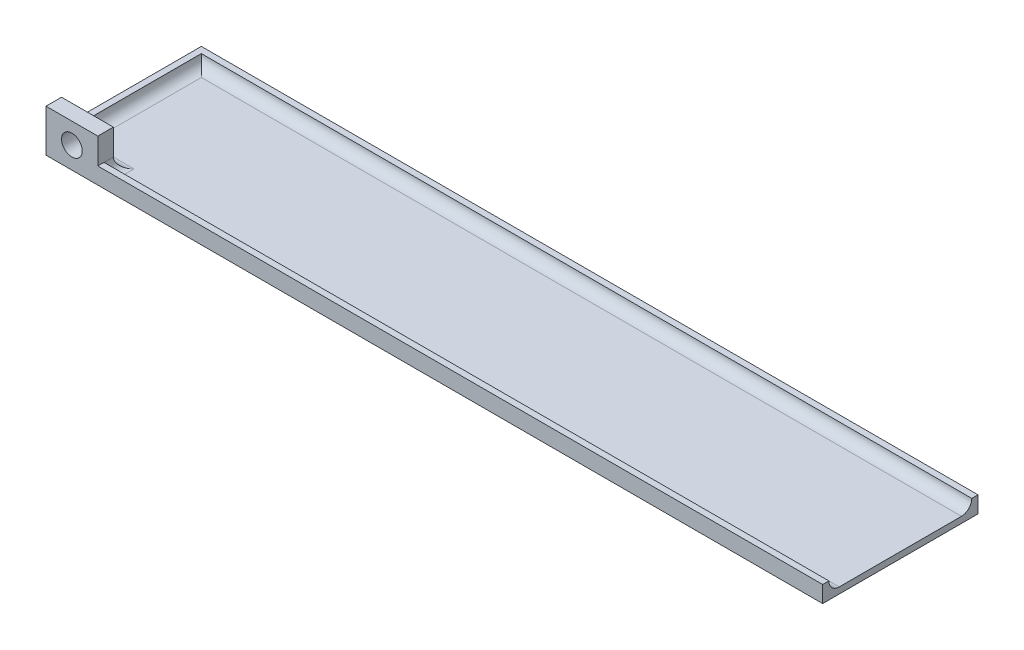
ISO-10303-21;
HEADER;
FILE_DESCRIPTION(('STEP AP214'),'2;1');
FILE_NAME('part.step','',(''),(''),'','','');
FILE_SCHEMA(('AUTOMOTIVE_DESIGN { 1 0 10303 214 1 1 1 1 }'));
ENDSEC;
DATA;
#1=APPLICATION_CONTEXT('core data for automotive mechanical design processes');
#2=APPLICATION_PROTOCOL_DEFINITION('international standard','automotive_design',2000,#1);
#3=PRODUCT_CONTEXT('',#1,'mechanical');
#4=PRODUCT('Part','Part','',(#3));
#5=PRODUCT_RELATED_PRODUCT_CATEGORY('part','',(#4));
#6=PRODUCT_DEFINITION_FORMATION('','',#4);
#7=PRODUCT_DEFINITION_CONTEXT('part definition',#1,'design');
#8=PRODUCT_DEFINITION('design','',#6,#7);
#9=PRODUCT_DEFINITION_SHAPE('','',#8);
#10=(LENGTH_UNIT() NAMED_UNIT(*) SI_UNIT(.MILLI.,.METRE.));
#11=(NAMED_UNIT(*) PLANE_ANGLE_UNIT() SI_UNIT($,.RADIAN.));
#12=(NAMED_UNIT(*) SI_UNIT($,.STERADIAN.) SOLID_ANGLE_UNIT());
#13=UNCERTAINTY_MEASURE_WITH_UNIT(LENGTH_MEASURE(1.E-05),#10,'distance_accuracy_value','');
#14=(GEOMETRIC_REPRESENTATION_CONTEXT(3) GLOBAL_UNCERTAINTY_ASSIGNED_CONTEXT((#13)) GLOBAL_UNIT_ASSIGNED_CONTEXT((#10,
#11,#12)) REPRESENTATION_CONTEXT('',''));
#15=CARTESIAN_POINT('',(0.,0.,0.));
#16=DIRECTION('',(0.,0.,1.));
#17=DIRECTION('',(1.,0.,0.));
#18=AXIS2_PLACEMENT_3D('',#15,#16,#17);
#19=CARTESIAN_POINT('',(0.,1.2,0.));
#20=DIRECTION('',(0.,1.,0.));
#21=DIRECTION('',(0.,0.,1.));
#22=AXIS2_PLACEMENT_3D('',#19,#20,#21);
#23=PLANE('',#22);
#24=DIRECTION('',(0.,0.,-1.));
#25=VECTOR('',#24,1.);
#26=CARTESIAN_POINT('',(74.9999999999999,1.2,-15.));
#27=LINE('',#26,#25);
#28=CARTESIAN_POINT('',(74.9999999999999,1.2,11.8));
#29=VERTEX_POINT('',#28);
#30=CARTESIAN_POINT('',(74.9999999999999,1.2,-11.8));
#31=VERTEX_POINT('',#30);
#32=EDGE_CURVE('E297',#29,#31,#27,.T.);
#33=ORIENTED_EDGE('',*,*,#32,.T.);
#34=DIRECTION('',(1.,0.,0.));
#35=VECTOR('',#34,1.);
#36=CARTESIAN_POINT('',(0.,1.2,-11.8));
#37=LINE('',#36,#35);
#38=CARTESIAN_POINT('',(-71.8000000000001,1.2,-11.8));
#39=VERTEX_POINT('',#38);
#40=EDGE_CURVE('E60',#31,#39,#37,.F.);
#41=ORIENTED_EDGE('',*,*,#40,.T.);
#42=DIRECTION('',(0.,0.,-1.));
#43=VECTOR('',#42,1.);
#44=CARTESIAN_POINT('',(-71.8000000000001,1.2,0.));
#45=LINE('',#44,#43);
#46=CARTESIAN_POINT('',(-71.8000000000001,1.2,9.99999999999998));
#47=VERTEX_POINT('',#46);
#48=EDGE_CURVE('E65',#39,#47,#45,.F.);
#49=ORIENTED_EDGE('',*,*,#48,.T.);
#50=DIRECTION('',(-1.,0.,0.));
#51=VECTOR('',#50,1.);
#52=CARTESIAN_POINT('',(0.,1.2,9.99999999999999));
#53=LINE('',#52,#51);
#54=CARTESIAN_POINT('',(-71.7320508075689,1.2,9.99999999999998));
#55=VERTEX_POINT('',#54);
#56=EDGE_CURVE('E182',#47,#55,#53,.F.);
#57=ORIENTED_EDGE('',*,*,#56,.T.);
#58=CARTESIAN_POINT('',(-72.3361605436258,1.2,10.074613416251));
#59=CARTESIAN_POINT('',(-71.7793432797953,1.2,12.2294552747499));
#60=CARTESIAN_POINT('',(-71.8386351752789,3.41296715937179,12.));
#61=CARTESIAN_POINT('',(-72.2780480130461,1.2,10.0595857814593));
#62=CARTESIAN_POINT('',(-71.7834580219336,1.2,12.2113937022727));
#63=CARTESIAN_POINT('',(-71.8315296040001,3.39641677519278,12.));
#64=CARTESIAN_POINT('',(-72.2193466671237,1.2,10.0469134668366));
#65=CARTESIAN_POINT('',(-71.78550810038,1.2,12.1917046451878));
#66=CARTESIAN_POINT('',(-71.8237265095642,3.37875992428455,12.));
#67=CARTESIAN_POINT('',(-72.1008864416683,1.2,10.0260887534728));
#68=CARTESIAN_POINT('',(-71.7844563230043,1.2,12.14950428987));
#69=CARTESIAN_POINT('',(-71.8061757181743,3.34082048307898,12.));
#70=CARTESIAN_POINT('',(-72.0411241173482,1.2,10.017955880954));
#71=CARTESIAN_POINT('',(-71.7813860427762,1.2,12.1270342497116));
#72=CARTESIAN_POINT('',(-71.7964198620172,3.32052700541513,12.));
#73=CARTESIAN_POINT('',(-71.9216495936106,1.2,10.0061929621261));
#74=CARTESIAN_POINT('',(-71.7692815314671,1.2,12.0800013050037));
#75=CARTESIAN_POINT('',(-71.7745546166674,3.27721292130921,12.));
#76=CARTESIAN_POINT('',(-71.861940896979,1.2,10.0025270347042));
#77=CARTESIAN_POINT('',(-71.760370721576,1.2,12.055514701291));
#78=CARTESIAN_POINT('',(-71.7624648977458,3.25421569539413,12.));
#79=CARTESIAN_POINT('',(-71.772400913129,1.2,10.0001363519426));
#80=CARTESIAN_POINT('',(-71.7419098579096,1.2,12.0174692649333));
#81=CARTESIAN_POINT('',(-71.7420105769733,3.21735238064977,12.));
#82=CARTESIAN_POINT('',(-71.742602447226,1.2,9.999855610103));
#83=CARTESIAN_POINT('',(-71.7349686393547,1.2,12.0046580087224));
#84=CARTESIAN_POINT('',(-71.7348182722216,3.20469063480429,12.));
#85=CARTESIAN_POINT('',(-71.6830109305521,1.2,10.0002828795743));
#86=CARTESIAN_POINT('',(-71.7193202778669,1.2,11.9787149718989));
#87=CARTESIAN_POINT('',(-71.7195397778625,3.1785271605937,12.));
#88=CARTESIAN_POINT('',(-71.6532178805064,1.2,10.0009909795572));
#89=CARTESIAN_POINT('',(-71.7106271482965,1.2,11.965589784079));
#90=CARTESIAN_POINT('',(-71.711453508151,3.16502535700224,12.));
#91=CARTESIAN_POINT('',(-71.5198567668734,1.2,10.0063015516842));
#92=CARTESIAN_POINT('',(-71.6678853766301,1.2,11.906746009344));
#93=CARTESIAN_POINT('',(-71.6729986446206,3.10254768616981,12.));
#94=CARTESIAN_POINT('',(-71.416459257844,1.2,10.0162064163513));
#95=CARTESIAN_POINT('',(-71.623581120779,1.2,11.8593220504645));
#96=CARTESIAN_POINT('',(-71.6370780063262,3.04859227062018,12.));
#97=CARTESIAN_POINT('',(-71.2624012086411,1.2,10.0379133282181));
#98=CARTESIAN_POINT('',(-71.5361260303841,1.2,11.7884868200293));
#99=CARTESIAN_POINT('',(-71.5685927096965,2.9586727383819,12.));
#100=CARTESIAN_POINT('',(-71.2111941831751,1.2,10.0462969502341));
#101=CARTESIAN_POINT('',(-71.5039275746085,1.2,11.7651847206798));
#102=CARTESIAN_POINT('',(-71.5433126133241,2.92718238462153,12.));
#103=CARTESIAN_POINT('',(-71.1091176563972,1.2,10.0649236287315));
#104=CARTESIAN_POINT('',(-71.4323079066144,1.2,11.7194356133435));
#105=CARTESIAN_POINT('',(-71.48650082509,2.86126050765092,12.));
#106=CARTESIAN_POINT('',(-71.0582481383648,1.2,10.075166592375));
#107=CARTESIAN_POINT('',(-71.3930230577661,1.2,11.6969983897116));
#108=CARTESIAN_POINT('',(-71.4549694453513,2.8268291313331,12.));
#109=CARTESIAN_POINT('',(-70.9568966571514,1.2,10.0969825843311));
#110=CARTESIAN_POINT('',(-71.3068412249275,1.2,11.6536031765381));
#111=CARTESIAN_POINT('',(-71.3841060809588,2.75543238469486,12.));
#112=CARTESIAN_POINT('',(-70.9064141698811,1.2,10.1085532428426));
#113=CARTESIAN_POINT('',(-71.2601022670233,1.2,11.6326381424602));
#114=CARTESIAN_POINT('',(-71.3447879065872,2.71847157533647,12.));
#115=CARTESIAN_POINT('',(-70.8056171026324,1.2,10.1323962816697));
#116=CARTESIAN_POINT('',(-71.1585527503052,1.2,11.5927432010098));
#117=CARTESIAN_POINT('',(-71.2564024483976,2.64281015255396,12.));
#118=CARTESIAN_POINT('',(-70.7553025258216,1.2,10.1446686751453));
#119=CARTESIAN_POINT('',(-71.103878840332,1.2,11.5737900609705));
#120=CARTESIAN_POINT('',(-71.2073349817048,2.60410950650493,12.));
#121=CARTESIAN_POINT('',(-70.654642318298,1.2,10.1691033108521));
#122=CARTESIAN_POINT('',(-70.9861917652828,1.2,11.5385236212672));
#123=CARTESIAN_POINT('',(-71.0974118846476,2.52661811547286,12.));
#124=CARTESIAN_POINT('',(-70.6042966856264,1.2,10.1812655451651));
#125=CARTESIAN_POINT('',(-70.9232815336361,1.2,11.5221670410715));
#126=CARTESIAN_POINT('',(-71.0365554138279,2.48782736426101,12.));
#127=CARTESIAN_POINT('',(-70.5033257844245,1.2,10.2044603453027));
#128=CARTESIAN_POINT('',(-70.7891821908066,1.2,11.4926966209242));
#129=CARTESIAN_POINT('',(-70.9013503902115,2.41295542475095,12.));
#130=CARTESIAN_POINT('',(-70.452700456864,1.2,10.2154926622448));
#131=CARTESIAN_POINT('',(-70.7180178214445,1.2,11.4795212852324));
#132=CARTESIAN_POINT('',(-70.8269988748707,2.37687483387351,12.));
#133=CARTESIAN_POINT('',(-70.3492931979017,1.2,10.2355269021685));
#134=CARTESIAN_POINT('',(-70.5657319571436,1.2,11.4566375860778));
#135=CARTESIAN_POINT('',(-70.661754474357,2.31049547907798,12.));
#136=CARTESIAN_POINT('',(-70.2964952257947,1.2,10.2444498167125));
#137=CARTESIAN_POINT('',(-70.4842124036593,1.2,11.4469751179635));
#138=CARTESIAN_POINT('',(-70.5703967297114,2.28042678130087,12.));
#139=CARTESIAN_POINT('',(-70.1903926636367,1.2,10.2583747683858));
#140=CARTESIAN_POINT('',(-70.3154280767466,1.2,11.4323158895251));
#141=CARTESIAN_POINT('',(-70.3757460212835,2.23308199801374,12.));
#142=CARTESIAN_POINT('',(-70.1370884738184,1.2,10.2633796781619));
#143=CARTESIAN_POINT('',(-70.2278430707909,1.2,11.427246326394));
#144=CARTESIAN_POINT('',(-70.2724618657198,2.2157965404595,12.));
#145=CARTESIAN_POINT('',(-70.0303813271844,1.2,10.2684870942112));
#146=CARTESIAN_POINT('',(-70.0510135176194,1.2,11.4221048708794));
#147=CARTESIAN_POINT('',(-70.0613095995715,2.19815316596717,12.));
#148=CARTESIAN_POINT('',(-69.9769790823435,1.2,10.2686035017004));
#149=CARTESIAN_POINT('',(-69.9612848308279,1.2,11.4219897841798));
#150=CARTESIAN_POINT('',(-69.9534553603686,2.19774724946306,12.));
#151=CARTESIAN_POINT('',(-69.8703810158563,1.2,10.2639433521761));
#152=CARTESIAN_POINT('',(-69.7844717372595,1.2,11.4266761642059));
#153=CARTESIAN_POINT('',(-69.7421500665661,2.21385156963957,12.));
#154=CARTESIAN_POINT('',(-69.8171852909891,1.2,10.2591647272284));
#155=CARTESIAN_POINT('',(-69.6968939750932,1.2,11.4315062977828));
#156=CARTESIAN_POINT('',(-69.6387008921488,2.23036895566564,12.));
#157=CARTESIAN_POINT('',(-69.7112468492047,1.2,10.2456441650482));
#158=CARTESIAN_POINT('',(-69.5278896898425,1.2,11.4456959770241));
#159=CARTESIAN_POINT('',(-69.4433349489239,2.27638791643271,12.));
#160=CARTESIAN_POINT('',(-69.6585049695612,1.2,10.2368960495081));
#161=CARTESIAN_POINT('',(-69.4461401608297,1.2,11.4551304239792));
#162=CARTESIAN_POINT('',(-69.3514364439507,2.30590972979532,12.));
#163=CARTESIAN_POINT('',(-69.5535243738519,1.2,10.2168212397535));
#164=CARTESIAN_POINT('',(-69.2907971121403,1.2,11.4779549233287));
#165=CARTESIAN_POINT('',(-69.1823174982531,2.37251499605689,12.));
#166=CARTESIAN_POINT('',(-69.5012857886613,1.2,10.205493892753));
#167=CARTESIAN_POINT('',(-69.2170780423983,1.2,11.4914255100169));
#168=CARTESIAN_POINT('',(-69.1051007824848,2.40960036299193,12.));
#169=CARTESIAN_POINT('',(-69.3969179398216,1.2,10.1815690626473));
#170=CARTESIAN_POINT('',(-69.0781415032056,1.2,11.5217536025434));
#171=CARTESIAN_POINT('',(-68.9648087820978,2.48686555053253,12.));
#172=CARTESIAN_POINT('',(-69.3447897006872,1.2,10.1689672678977));
#173=CARTESIAN_POINT('',(-69.0129857977893,1.2,11.5386912371512));
#174=CARTESIAN_POINT('',(-68.9017839991559,2.52705575916166,12.));
#175=CARTESIAN_POINT('',(-69.2405686667559,1.2,10.1436645154702));
#176=CARTESIAN_POINT('',(-68.8913978575504,1.2,11.5752892822053));
#177=CARTESIAN_POINT('',(-68.7883489716435,2.60728744548503,12.));
#178=CARTESIAN_POINT('',(-69.1884758669042,1.2,10.130963578498));
#179=CARTESIAN_POINT('',(-68.8350797674141,1.2,11.5949969733882));
#180=CARTESIAN_POINT('',(-68.7379361621396,2.64732895178676,12.));
#181=CARTESIAN_POINT('',(-69.1014701072708,1.2,10.1104467377593));
#182=CARTESIAN_POINT('',(-68.7483578682455,1.2,11.6295153612892));
#183=CARTESIAN_POINT('',(-68.662511219306,2.71248448451311,12.));
#184=CARTESIAN_POINT('',(-69.0666095054485,1.2,10.1024118441806));
#185=CARTESIAN_POINT('',(-68.7154742525914,1.2,11.6438416922012));
#186=CARTESIAN_POINT('',(-68.6346293597919,2.73813139348348,12.));
#187=CARTESIAN_POINT('',(-68.9967865819573,1.2,10.0869127109574));
#188=CARTESIAN_POINT('',(-68.6533211690158,1.2,11.6732375768031));
#189=CARTESIAN_POINT('',(-68.582854032703,2.78826436690633,12.));
#190=CARTESIAN_POINT('',(-68.9618243499222,1.2,10.0794480707928));
#191=CARTESIAN_POINT('',(-68.6240959232971,1.2,11.6883099300894));
#192=CARTESIAN_POINT('',(-68.5589577516176,2.81275124143597,12.));
#193=CARTESIAN_POINT('',(-68.8918528389939,1.2,10.0652902246958));
#194=CARTESIAN_POINT('',(-68.5691726275658,1.2,11.7189740409565));
#195=CARTESIAN_POINT('',(-68.5146222245463,2.86033367713761,12.));
#196=CARTESIAN_POINT('',(-68.8568440224695,1.2,10.0585947531274));
#197=CARTESIAN_POINT('',(-68.5435093125422,1.2,11.7345640392357));
#198=CARTESIAN_POINT('',(-68.4941727380826,2.88343322356744,12.));
#199=CARTESIAN_POINT('',(-68.7866590876861,1.2,10.0461048665091));
#200=CARTESIAN_POINT('',(-68.4954513421389,1.2,11.7661283025772));
#201=CARTESIAN_POINT('',(-68.4561406750694,2.92824459364451,12.));
#202=CARTESIAN_POINT('',(-68.7514829432452,1.2,10.0403105975923));
#203=CARTESIAN_POINT('',(-68.4731007834471,1.2,11.7820989838776));
#204=CARTESIAN_POINT('',(-68.4385585634524,2.94995619189557,12.));
#205=CARTESIAN_POINT('',(-68.6810667611327,1.2,10.0297737793707));
#206=CARTESIAN_POINT('',(-68.4315752993804,1.2,11.8142018341307));
#207=CARTESIAN_POINT('',(-68.4058764437356,2.99191248928861,12.));
#208=CARTESIAN_POINT('',(-68.6458271381899,1.2,10.0250284902827));
#209=CARTESIAN_POINT('',(-68.4124315263176,1.2,11.8303277368899));
#210=CARTESIAN_POINT('',(-68.3907699969359,3.0121609145262,12.));
#211=CARTESIAN_POINT('',(-68.5752146155813,1.2,10.0166855628463));
#212=CARTESIAN_POINT('',(-68.3770957218328,1.2,11.862611540938));
#213=CARTESIAN_POINT('',(-68.3626218547909,3.0512741855141,12.));
#214=CARTESIAN_POINT('',(-68.5398417204557,1.2,10.0130878857537));
#215=CARTESIAN_POINT('',(-68.3609396337309,1.2,11.8787613425263));
#216=CARTESIAN_POINT('',(-68.3495800897482,3.07013907795674,12.));
#217=CARTESIAN_POINT('',(-68.4334584289673,1.2,10.0041617776619));
#218=CARTESIAN_POINT('',(-68.316420532553,1.2,11.9272678743168));
#219=CARTESIAN_POINT('',(-68.31303771612,3.12478103029897,12.));
#220=CARTESIAN_POINT('',(-68.3622758805134,1.2,10.0007146471411));
#221=CARTESIAN_POINT('',(-68.292636770634,1.2,11.9591615529308));
#222=CARTESIAN_POINT('',(-68.2921611563883,3.15855055873948,12.));
#223=CARTESIAN_POINT('',(-68.2203826795615,1.2,9.9994896241003));
#224=CARTESIAN_POINT('',(-68.2550162278604,1.2,12.0210041396043));
#225=CARTESIAN_POINT('',(-68.2556069756382,3.22102984084976,12.));
#226=CARTESIAN_POINT('',(-68.1496724538523,1.2,10.0016697673359));
#227=CARTESIAN_POINT('',(-68.2412954326595,1.2,12.0508796495376));
#228=CARTESIAN_POINT('',(-68.2398918510573,3.24977535044829,12.));
#229=CARTESIAN_POINT('',(-68.0087490724652,1.2,10.0120504566143));
#230=CARTESIAN_POINT('',(-68.2222715372145,1.2,12.1079035250162));
#231=CARTESIAN_POINT('',(-68.2121407842555,3.30308426864905,12.));
#232=CARTESIAN_POINT('',(-67.938535520955,1.2,10.0202454886614));
#233=CARTESIAN_POINT('',(-68.2170965584722,1.2,12.1349627617184));
#234=CARTESIAN_POINT('',(-68.2001014866178,3.32765148220764,12.));
#235=CARTESIAN_POINT('',(-67.7958047752946,1.2,10.043495383615));
#236=CARTESIAN_POINT('',(-68.2137782016904,1.2,12.1867481438579));
#237=CARTESIAN_POINT('',(-68.178216204176,3.37428512440002,12.));
#238=CARTESIAN_POINT('',(-67.7233369032047,1.2,10.0588580515346));
#239=CARTESIAN_POINT('',(-68.2160846690132,1.2,12.2111871886037));
#240=CARTESIAN_POINT('',(-68.1685018141156,3.39617697559391,12.));
#241=CARTESIAN_POINT('',(-67.5801030175907,1.2,10.0967044266412));
#242=CARTESIAN_POINT('',(-68.2270871845615,1.2,12.2555107149748));
#243=CARTESIAN_POINT('',(-68.151293060036,3.43663124776008,12.));
#244=CARTESIAN_POINT('',(-67.50934154847,1.2,10.119205281939));
#245=CARTESIAN_POINT('',(-68.2358625023626,1.2,12.2752920586018));
#246=CARTESIAN_POINT('',(-68.1438041270329,3.45518548078532,12.));
#247=CARTESIAN_POINT('',(-67.4399067736558,1.2,10.145331461972));
#248=CARTESIAN_POINT('',(-68.2469663312336,1.2,12.2923385669038));
#249=CARTESIAN_POINT('',(-68.1370763201916,3.47232193711172,12.));
#250=(BOUNDED_SURFACE() B_SPLINE_SURFACE(3,2,((#58,#59,#60),(#61,#62,#63),(#64,#65,#66),(#67,
#68,#69),(#70,#71,#72),(#73,#74,#75),(#76,#77,#78),(#79,#80,#81),(#82,#83,#84),(#85,#86,#87),
(#88,#89,#90),(#91,#92,#93),(#94,#95,#96),(#97,#98,#99),(#100,#101,#102),(#103,#104,#105),(#106,
#107,#108),(#109,#110,#111),(#112,#113,#114),(#115,#116,#117),(#118,#119,#120),(#121,#122,#123),
(#124,#125,#126),(#127,#128,#129),(#130,#131,#132),(#133,#134,#135),(#136,#137,#138),(#139,#140,
#141),(#142,#143,#144),(#145,#146,#147),(#148,#149,#150),(#151,#152,#153),(#154,#155,#156),
(#157,#158,#159),(#160,#161,#162),(#163,#164,#165),(#166,#167,#168),(#169,#170,#171),(#172,#173,
#174),(#175,#176,#177),(#178,#179,#180),(#181,#182,#183),(#184,#185,#186),(#187,#188,#189),
(#190,#191,#192),(#193,#194,#195),(#196,#197,#198),(#199,#200,#201),(#202,#203,#204),(#205,#206,
#207),(#208,#209,#210),(#211,#212,#213),(#214,#215,#216),(#217,#218,#219),(#220,#221,#222),
(#223,#224,#225),(#226,#227,#228),(#229,#230,#231),(#232,#233,#234),(#235,#236,#237),(#238,#239,
#240),(#241,#242,#243),(#244,#245,#246),(#247,#248,#249)),.UNSPECIFIED.,.F.,.F.,
.F.) B_SPLINE_SURFACE_WITH_KNOTS((4,2,2,2,2,2,2,2,2,2,2,2,2,2,2,2,2,2,2,2,2,2,2,2,2,2,2,2,2,2,2,
4),(3,3),(0.,0.179994283229712,0.360756952590891,0.540057850338917,0.629442511009645,
0.718835187542183,1.02979286663016,1.18543994062859,1.34107924521277,1.49644494831487,
1.65181356600539,1.80719326423215,1.96260711404853,2.12314912757414,2.28357332257307,
2.44354129545877,2.60357687560064,2.76386240185096,2.92418854046656,3.08507648408033,
3.24593168080052,3.35325218144313,3.4604965984724,3.56741654893543,3.67435381881034,
3.78100839443902,3.88765936896402,4.10124143099464,4.31323535777596,4.52503518688483,
4.74691128963745,4.96932449521418),(0.,1.),
.UNSPECIFIED.) GEOMETRIC_REPRESENTATION_ITEM() RATIONAL_B_SPLINE_SURFACE(((1.,0.668399738298164,
1.),(1.,0.671494024024242,1.),(1.,0.674775425338037,1.),(1.,0.681767902123051,1.),(1.,
0.685480752050687,1.),(1.,0.693333970372747,1.),(1.,0.697470638757847,1.),(1.,0.704035982689174,
1.),(1.,0.706280878300952,1.),(1.,0.710896281513148,1.),(1.,0.713266800360179,1.),(1.,
0.724178951918505,1.),(1.,0.733453354623828,1.),(1.,0.748569997150039,1.),(1.,0.753812875793215,
1.),(1.,0.764666150688091,1.),(1.,0.770276528581399,1.),(1.,0.78177670581825,1.),(1.,
0.787665996623514,1.),(1.,0.799582924009319,1.),(1.,0.805610563183089,1.),(1.,0.817545679755441,
1.),(1.,0.823453148553701,1.),(1.,0.834741232524384,1.),(1.,0.840121731611937,1.),(1.,
0.849941839833552,1.),(1.,0.854344544349526,1.),(1.,0.861244453456054,1.),(1.,0.863743054083137,
1.),(1.,0.86629311442438,1.),(1.,0.86635151322929,1.),(1.,0.864024338622803,1.),(1.,
0.861637732305123,1.),(1.,0.854934888363459,1.),(1.,0.850615642832256,1.),(1.,0.840770663407192,
1.),(1.,0.835244624096482,1.),(1.,0.823600469452163,1.),(1.,0.81748034725632,1.),(1.,
0.80511892477993,1.),(1.,0.798877649417336,1.),(1.,0.788603792828466,1.),(1.,0.784527441127084,
1.),(1.,0.776498541950068,1.),(1.,0.772545908753625,1.),(1.,0.764808162603084,1.),(1.,
0.761022578999414,1.),(1.,0.753626255349649,1.),(1.,0.750015543724891,1.),(1.,0.742990035451008,
1.),(1.,0.739574746123414,1.),(1.,0.732934150277713,1.),(1.,0.729708837348885,1.),(1.,
0.720308365601162,1.),(1.,0.714417890678002,1.),(1.,0.703400786644408,1.),(1.,0.698268803478021,
1.),(1.,0.688659525805582,1.),(1.,0.684181636180928,1.),(1.,0.675609432391563,1.),(1.,
0.671543501603376,1.),(1.,0.663969839942903,1.),(1.,0.660463484149772,1.),(1.,0.657205839689567,1.))) REPRESENTATION_ITEM('') SURFACE());
#251=CARTESIAN_POINT('',(-72.3361605436258,1.2,10.074613416251));
#252=CARTESIAN_POINT('',(-72.2780480130461,1.2,10.0595857814593));
#253=CARTESIAN_POINT('',(-72.2193466671237,1.2,10.0469134668366));
#254=CARTESIAN_POINT('',(-72.1008864416683,1.2,10.0260887534728));
#255=CARTESIAN_POINT('',(-72.0411241173482,1.2,10.017955880954));
#256=CARTESIAN_POINT('',(-71.9216495936106,1.2,10.0061929621261));
#257=CARTESIAN_POINT('',(-71.861940896979,1.2,10.0025270347042));
#258=CARTESIAN_POINT('',(-71.772400913129,1.2,10.0001363519426));
#259=CARTESIAN_POINT('',(-71.742602447226,1.2,9.999855610103));
#260=CARTESIAN_POINT('',(-71.6830109305521,1.2,10.0002828795743));
#261=CARTESIAN_POINT('',(-71.6532178805064,1.2,10.0009909795572));
#262=CARTESIAN_POINT('',(-71.5198567668735,1.2,10.0063015516842));
#263=CARTESIAN_POINT('',(-71.416459257844,1.2,10.0162064163513));
#264=CARTESIAN_POINT('',(-71.2624012086411,1.2,10.0379133282181));
#265=CARTESIAN_POINT('',(-71.2111941831751,1.2,10.0462969502341));
#266=CARTESIAN_POINT('',(-71.1091176563972,1.2,10.0649236287315));
#267=CARTESIAN_POINT('',(-71.0582481383648,1.2,10.075166592375));
#268=CARTESIAN_POINT('',(-70.9568966571514,1.2,10.0969825843311));
#269=CARTESIAN_POINT('',(-70.9064141698811,1.2,10.1085532428426));
#270=CARTESIAN_POINT('',(-70.8056171026324,1.2,10.1323962816697));
#271=CARTESIAN_POINT('',(-70.7553025258216,1.2,10.1446686751453));
#272=CARTESIAN_POINT('',(-70.654642318298,1.2,10.1691033108521));
#273=CARTESIAN_POINT('',(-70.6042966856264,1.2,10.1812655451651));
#274=CARTESIAN_POINT('',(-70.5033257844245,1.2,10.2044603453027));
#275=CARTESIAN_POINT('',(-70.452700456864,1.2,10.2154926622448));
#276=CARTESIAN_POINT('',(-70.3492931979016,1.2,10.2355269021685));
#277=CARTESIAN_POINT('',(-70.2964952257946,1.2,10.2444498167125));
#278=CARTESIAN_POINT('',(-70.1903926636367,1.2,10.2583747683858));
#279=CARTESIAN_POINT('',(-70.1370884738184,1.2,10.2633796781619));
#280=CARTESIAN_POINT('',(-70.0303813271844,1.2,10.2684870942112));
#281=CARTESIAN_POINT('',(-69.9769790823435,1.2,10.2686035017004));
#282=CARTESIAN_POINT('',(-69.8703810158563,1.2,10.2639433521761));
#283=CARTESIAN_POINT('',(-69.8171852909891,1.2,10.2591647272284));
#284=CARTESIAN_POINT('',(-69.7112468492047,1.2,10.2456441650482));
#285=CARTESIAN_POINT('',(-69.6585049695612,1.2,10.2368960495081));
#286=CARTESIAN_POINT('',(-69.5535243738519,1.2,10.2168212397535));
#287=CARTESIAN_POINT('',(-69.5012857886613,1.2,10.2054938927529));
#288=CARTESIAN_POINT('',(-69.3969179398216,1.2,10.1815690626473));
#289=CARTESIAN_POINT('',(-69.3447897006872,1.2,10.1689672678977));
#290=CARTESIAN_POINT('',(-69.2405686667559,1.2,10.1436645154702));
#291=CARTESIAN_POINT('',(-69.1884758669042,1.2,10.130963578498));
#292=CARTESIAN_POINT('',(-69.1014701072708,1.2,10.1104467377593));
#293=CARTESIAN_POINT('',(-69.0666095054485,1.2,10.1024118441806));
#294=CARTESIAN_POINT('',(-68.9967865819573,1.2,10.0869127109574));
#295=CARTESIAN_POINT('',(-68.9618243499222,1.2,10.0794480707928));
#296=CARTESIAN_POINT('',(-68.8918528389939,1.2,10.0652902246958));
#297=CARTESIAN_POINT('',(-68.8568440224695,1.2,10.0585947531274));
#298=CARTESIAN_POINT('',(-68.7866590876861,1.2,10.0461048665091));
#299=CARTESIAN_POINT('',(-68.7514829432452,1.2,10.0403105975923));
#300=CARTESIAN_POINT('',(-68.6810667611327,1.2,10.0297737793707));
#301=CARTESIAN_POINT('',(-68.6458271381899,1.2,10.0250284902827));
#302=CARTESIAN_POINT('',(-68.5752146155813,1.2,10.0166855628463));
#303=CARTESIAN_POINT('',(-68.5398417204557,1.2,10.0130878857537));
#304=CARTESIAN_POINT('',(-68.4334584289674,1.2,10.0041617776619));
#305=CARTESIAN_POINT('',(-68.3622758805134,1.2,10.0007146471411));
#306=CARTESIAN_POINT('',(-68.2203826795615,1.2,9.9994896241003));
#307=CARTESIAN_POINT('',(-68.1496724538523,1.2,10.0016697673359));
#308=CARTESIAN_POINT('',(-68.0087490724652,1.2,10.0120504566143));
#309=CARTESIAN_POINT('',(-67.938535520955,1.2,10.0202454886614));
#310=CARTESIAN_POINT('',(-67.7958047752946,1.2,10.043495383615));
#311=CARTESIAN_POINT('',(-67.7233369032047,1.2,10.0588580515346));
#312=CARTESIAN_POINT('',(-67.5801030175907,1.2,10.0967044266412));
#313=CARTESIAN_POINT('',(-67.50934154847,1.2,10.119205281939));
#314=CARTESIAN_POINT('',(-67.4399067736558,1.2,10.145331461972));
#315=B_SPLINE_CURVE_WITH_KNOTS('',3,(#251,#252,#253,#254,#255,#256,#257,#258,#259,#260,#261,
#262,#263,#264,#265,#266,#267,#268,#269,#270,#271,#272,#273,#274,#275,#276,#277,#278,#279,#280,
#281,#282,#283,#284,#285,#286,#287,#288,#289,#290,#291,#292,#293,#294,#295,#296,#297,#298,#299,
#300,#301,#302,#303,#304,#305,#306,#307,#308,#309,#310,#311,#312,#313,#314),.UNSPECIFIED.,.F.,
.F.,(4,2,2,2,2,2,2,2,2,2,2,2,2,2,2,2,2,2,2,2,2,2,2,2,2,2,2,2,2,2,2,4),(0.,0.179994283229712,
0.360756952590891,0.540057850338917,0.629442511009645,0.718835187542183,1.02979286663016,
1.18543994062859,1.34107924521277,1.49644494831487,1.65181356600539,1.80719326423215,
1.96260711404853,2.12314912757414,2.28357332257307,2.44354129545877,2.60357687560064,
2.76386240185096,2.92418854046656,3.08507648408033,3.24593168080052,3.35325218144313,
3.4604965984724,3.56741654893543,3.67435381881034,3.78100839443902,3.88765936896402,
4.10124143099464,4.31323535777596,4.52503518688483,4.74691128963745,4.96932449521418),.UNSPECIFIED.);
#316=CARTESIAN_POINT('',(-68.2679491924312,1.2,9.99999999999998));
#317=VERTEX_POINT('',#316);
#318=EDGE_CURVE('E237',#55,#317,#315,.T.);
#319=ORIENTED_EDGE('',*,*,#318,.T.);
#320=DIRECTION('',(-1.,0.,0.));
#321=VECTOR('',#320,1.);
#322=CARTESIAN_POINT('',(0.,1.2,9.99999999999999));
#323=LINE('',#322,#321);
#324=CARTESIAN_POINT('',(-63.0000000000001,1.2,9.99999999999998));
#325=VERTEX_POINT('',#324);
#326=EDGE_CURVE('E245',#317,#325,#323,.F.);
#327=ORIENTED_EDGE('',*,*,#326,.T.);
#328=DIRECTION('',(0.,0.,-1.));
#329=VECTOR('',#328,1.);
#330=CARTESIAN_POINT('',(-63.0000000000001,1.2,0.));
#331=LINE('',#330,#329);
#332=CARTESIAN_POINT('',(-63.0000000000001,1.2,11.8));
#333=VERTEX_POINT('',#332);
#334=EDGE_CURVE('E290',#325,#333,#331,.F.);
#335=ORIENTED_EDGE('',*,*,#334,.T.);
#336=DIRECTION('',(-1.,0.,0.));
#337=VECTOR('',#336,1.);
#338=CARTESIAN_POINT('',(0.,1.2,11.8));
#339=LINE('',#338,#337);
#340=EDGE_CURVE('E283',#333,#29,#339,.F.);
#341=ORIENTED_EDGE('',*,*,#340,.T.);
#342=EDGE_LOOP('',(#33,#41,#49,#57,#319,#327,#335,#341));
#343=FACE_BOUND('',#342,.T.);
#344=ADVANCED_FACE('F43',(#343),#23,.T.);
#345=CARTESIAN_POINT('',(-75.0000000000001,8.2,12.));
#346=DIRECTION('',(0.,0.,1.));
#347=DIRECTION('',(1.,0.,0.));
#348=AXIS2_PLACEMENT_3D('',#345,#346,#347);
#349=PLANE('',#348);
#350=DIRECTION('',(0.,-1.,0.));
#351=VECTOR('',#350,1.);
#352=CARTESIAN_POINT('',(-65.0000000000001,8.2,12.));
#353=LINE('',#352,#351);
#354=CARTESIAN_POINT('',(-65.0000000000001,8.2,12.));
#355=VERTEX_POINT('',#354);
#356=CARTESIAN_POINT('',(-65.0000000000001,3.2,12.));
#357=VERTEX_POINT('',#356);
#358=EDGE_CURVE('E282',#355,#357,#353,.T.);
#359=ORIENTED_EDGE('',*,*,#358,.T.);
#360=DIRECTION('',(-1.,0.,0.));
#361=VECTOR('',#360,1.);
#362=CARTESIAN_POINT('',(-75.0000000000001,3.2,12.));
#363=LINE('',#362,#361);
#364=CARTESIAN_POINT('',(-68.2679491924312,3.2,12.));
#365=VERTEX_POINT('',#364);
#366=EDGE_CURVE('E163',#357,#365,#363,.T.);
#367=ORIENTED_EDGE('',*,*,#366,.T.);
#368=CARTESIAN_POINT('',(-70.0000000000001,4.2,12.));
#369=DIRECTION('',(0.,0.,1.));
#370=DIRECTION('',(1.,0.,0.));
#371=AXIS2_PLACEMENT_3D('',#368,#369,#370);
#372=CIRCLE('',#371,2.);
#373=CARTESIAN_POINT('',(-71.7320508075689,3.2,12.));
#374=VERTEX_POINT('',#373);
#375=EDGE_CURVE('E157',#365,#374,#372,.T.);
#376=ORIENTED_EDGE('',*,*,#375,.T.);
#377=DIRECTION('',(-1.,0.,0.));
#378=VECTOR('',#377,1.);
#379=CARTESIAN_POINT('',(-75.0000000000001,3.2,12.));
#380=LINE('',#379,#378);
#381=CARTESIAN_POINT('',(-73.8000000000001,3.2,12.));
#382=VERTEX_POINT('',#381);
#383=EDGE_CURVE('E148',#374,#382,#380,.T.);
#384=ORIENTED_EDGE('',*,*,#383,.T.);
#385=DIRECTION('',(1.,0.,0.));
#386=VECTOR('',#385,1.);
#387=CARTESIAN_POINT('',(-75.0000000000001,3.2,12.));
#388=LINE('',#387,#386);
#389=CARTESIAN_POINT('',(-75.0000000000001,3.2,12.));
#390=VERTEX_POINT('',#389);
#391=EDGE_CURVE('E153',#390,#382,#388,.T.);
#392=ORIENTED_EDGE('',*,*,#391,.F.);
#393=DIRECTION('',(0.,-1.,0.));
#394=VECTOR('',#393,1.);
#395=CARTESIAN_POINT('',(-75.0000000000001,8.2,12.));
#396=LINE('',#395,#394);
#397=CARTESIAN_POINT('',(-75.0000000000001,8.2,12.));
#398=VERTEX_POINT('',#397);
#399=EDGE_CURVE('E358',#398,#390,#396,.T.);
#400=ORIENTED_EDGE('',*,*,#399,.F.);
#401=DIRECTION('',(-1.,0.,0.));
#402=VECTOR('',#401,1.);
#403=CARTESIAN_POINT('',(-75.0000000000001,8.2,12.));
#404=LINE('',#403,#402);
#405=EDGE_CURVE('E360',#355,#398,#404,.T.);
#406=ORIENTED_EDGE('',*,*,#405,.F.);
#407=EDGE_LOOP('',(#359,#367,#376,#384,#392,#400,#406));
#408=FACE_BOUND('',#407,.T.);
#409=ADVANCED_FACE('F151',(#408),#349,.F.);
#410=CARTESIAN_POINT('',(0.,3.2,0.));
#411=DIRECTION('',(0.,-1.,0.));
#412=DIRECTION('',(0.,0.,-1.));
#413=AXIS2_PLACEMENT_3D('',#410,#411,#412);
#414=PLANE('',#413);
#415=DIRECTION('',(0.,0.,-1.));
#416=VECTOR('',#415,1.);
#417=CARTESIAN_POINT('',(-65.0000000000001,3.2,0.));
#418=LINE('',#417,#416);
#419=CARTESIAN_POINT('',(-65.0000000000001,3.2,15.));
#420=VERTEX_POINT('',#419);
#421=CARTESIAN_POINT('',(-65.0000000000001,3.2,13.8));
#422=VERTEX_POINT('',#421);
#423=EDGE_CURVE('E164',#420,#422,#418,.T.);
#424=ORIENTED_EDGE('',*,*,#423,.F.);
#425=DIRECTION('',(1.,0.,0.));
#426=VECTOR('',#425,1.);
#427=CARTESIAN_POINT('',(-75.0000000000001,3.2,15.));
#428=LINE('',#427,#426);
#429=CARTESIAN_POINT('',(74.9999999999999,3.2,15.));
#430=VERTEX_POINT('',#429);
#431=EDGE_CURVE('E338',#420,#430,#428,.T.);
#432=ORIENTED_EDGE('',*,*,#431,.T.);
#433=DIRECTION('',(0.,0.,-1.));
#434=VECTOR('',#433,1.);
#435=CARTESIAN_POINT('',(74.9999999999999,3.2,15.));
#436=LINE('',#435,#434);
#437=CARTESIAN_POINT('',(74.9999999999999,3.2,13.8));
#438=VERTEX_POINT('',#437);
#439=EDGE_CURVE('E343',#430,#438,#436,.T.);
#440=ORIENTED_EDGE('',*,*,#439,.T.);
#441=DIRECTION('',(-1.,0.,0.));
#442=VECTOR('',#441,1.);
#443=CARTESIAN_POINT('',(-75.0000000000001,3.2,13.8));
#444=LINE('',#443,#442);
#445=EDGE_CURVE('E295',#438,#422,#444,.T.);
#446=ORIENTED_EDGE('',*,*,#445,.T.);
#447=EDGE_LOOP('',(#424,#432,#440,#446));
#448=FACE_BOUND('',#447,.T.);
#449=ADVANCED_FACE('F225',(#448),#414,.F.);
#450=CARTESIAN_POINT('',(74.9999999999999,1.2,-15.));
#451=DIRECTION('',(-1.,0.,0.));
#452=DIRECTION('',(0.,0.,1.));
#453=AXIS2_PLACEMENT_3D('',#450,#451,#452);
#454=PLANE('',#453);
#455=DIRECTION('',(0.,0.,-1.));
#456=VECTOR('',#455,1.);
#457=CARTESIAN_POINT('',(74.9999999999999,0.,-15.));
#458=LINE('',#457,#456);
#459=CARTESIAN_POINT('',(74.9999999999999,0.,15.));
#460=VERTEX_POINT('',#459);
#461=CARTESIAN_POINT('',(74.9999999999999,0.,-15.));
#462=VERTEX_POINT('',#461);
#463=EDGE_CURVE('E316',#460,#462,#458,.T.);
#464=ORIENTED_EDGE('',*,*,#463,.T.);
#465=DIRECTION('',(0.,-1.,0.));
#466=VECTOR('',#465,1.);
#467=CARTESIAN_POINT('',(74.9999999999999,1.2,-15.));
#468=LINE('',#467,#466);
#469=CARTESIAN_POINT('',(74.9999999999999,3.2,-15.));
#470=VERTEX_POINT('',#469);
#471=EDGE_CURVE('E325',#470,#462,#468,.T.);
#472=ORIENTED_EDGE('',*,*,#471,.F.);
#473=DIRECTION('',(0.,0.,-1.));
#474=VECTOR('',#473,1.);
#475=CARTESIAN_POINT('',(74.9999999999999,3.2,-15.));
#476=LINE('',#475,#474);
#477=CARTESIAN_POINT('',(74.9999999999999,3.2,-13.8));
#478=VERTEX_POINT('',#477);
#479=EDGE_CURVE('E350',#478,#470,#476,.T.);
#480=ORIENTED_EDGE('',*,*,#479,.F.);
#481=CARTESIAN_POINT('',(74.9999999999999,3.2,-11.8));
#482=DIRECTION('',(-1.,0.,0.));
#483=DIRECTION('',(0.,0.,1.));
#484=AXIS2_PLACEMENT_3D('',#481,#482,#483);
#485=CIRCLE('',#484,2.);
#486=EDGE_CURVE('E52',#478,#31,#485,.T.);
#487=ORIENTED_EDGE('',*,*,#486,.T.);
#488=ORIENTED_EDGE('',*,*,#32,.F.);
#489=CARTESIAN_POINT('',(74.9999999999999,3.2,11.8));
#490=DIRECTION('',(-1.,0.,0.));
#491=DIRECTION('',(0.,0.,1.));
#492=AXIS2_PLACEMENT_3D('',#489,#490,#491);
#493=CIRCLE('',#492,2.);
#494=EDGE_CURVE('E11',#29,#438,#493,.T.);
#495=ORIENTED_EDGE('',*,*,#494,.T.);
#496=ORIENTED_EDGE('',*,*,#439,.F.);
#497=DIRECTION('',(0.,-1.,0.));
#498=VECTOR('',#497,1.);
#499=CARTESIAN_POINT('',(74.9999999999999,1.2,15.));
#500=LINE('',#499,#498);
#501=EDGE_CURVE('E304',#430,#460,#500,.T.);
#502=ORIENTED_EDGE('',*,*,#501,.T.);
#503=EDGE_LOOP('',(#464,#472,#480,#487,#488,#495,#496,#502));
#504=FACE_BOUND('',#503,.T.);
#505=ADVANCED_FACE('F250',(#504),#454,.F.);
#506=CARTESIAN_POINT('',(-75.0000000000001,1.2,-15.));
#507=DIRECTION('',(0.,0.,1.));
#508=DIRECTION('',(1.,0.,0.));
#509=AXIS2_PLACEMENT_3D('',#506,#507,#508);
#510=PLANE('',#509);
#511=DIRECTION('',(0.,-1.,0.));
#512=VECTOR('',#511,1.);
#513=CARTESIAN_POINT('',(-75.0000000000001,1.2,-15.));
#514=LINE('',#513,#512);
#515=CARTESIAN_POINT('',(-75.0000000000001,3.2,-15.));
#516=VERTEX_POINT('',#515);
#517=CARTESIAN_POINT('',(-75.0000000000001,0.,-15.));
#518=VERTEX_POINT('',#517);
#519=EDGE_CURVE('E324',#516,#518,#514,.T.);
#520=ORIENTED_EDGE('',*,*,#519,.F.);
#521=DIRECTION('',(-1.,0.,0.));
#522=VECTOR('',#521,1.);
#523=CARTESIAN_POINT('',(-75.0000000000001,3.2,-15.));
#524=LINE('',#523,#522);
#525=EDGE_CURVE('E314',#470,#516,#524,.T.);
#526=ORIENTED_EDGE('',*,*,#525,.F.);
#527=ORIENTED_EDGE('',*,*,#471,.T.);
#528=DIRECTION('',(-1.,0.,0.));
#529=VECTOR('',#528,1.);
#530=CARTESIAN_POINT('',(-75.0000000000001,0.,-15.));
#531=LINE('',#530,#529);
#532=EDGE_CURVE('E318',#462,#518,#531,.T.);
#533=ORIENTED_EDGE('',*,*,#532,.T.);
#534=EDGE_LOOP('',(#520,#526,#527,#533));
#535=FACE_BOUND('',#534,.T.);
#536=ADVANCED_FACE('F353',(#535),#510,.F.);
#537=CARTESIAN_POINT('',(-75.0000000000001,1.2,-15.));
#538=DIRECTION('',(1.,0.,0.));
#539=DIRECTION('',(0.,0.,-1.));
#540=AXIS2_PLACEMENT_3D('',#537,#538,#539);
#541=PLANE('',#540);
#542=ORIENTED_EDGE('',*,*,#519,.T.);
#543=DIRECTION('',(0.,0.,1.));
#544=VECTOR('',#543,1.);
#545=CARTESIAN_POINT('',(-75.0000000000001,0.,-15.));
#546=LINE('',#545,#544);
#547=CARTESIAN_POINT('',(-75.0000000000001,0.,15.));
#548=VERTEX_POINT('',#547);
#549=EDGE_CURVE('E310',#518,#548,#546,.T.);
#550=ORIENTED_EDGE('',*,*,#549,.T.);
#551=DIRECTION('',(0.,-1.,0.));
#552=VECTOR('',#551,1.);
#553=CARTESIAN_POINT('',(-75.0000000000001,1.2,15.));
#554=LINE('',#553,#552);
#555=CARTESIAN_POINT('',(-75.0000000000001,8.2,15.));
#556=VERTEX_POINT('',#555);
#557=EDGE_CURVE('E308',#556,#548,#554,.T.);
#558=ORIENTED_EDGE('',*,*,#557,.F.);
#559=DIRECTION('',(0.,0.,1.));
#560=VECTOR('',#559,1.);
#561=CARTESIAN_POINT('',(-75.0000000000001,8.2,12.));
#562=LINE('',#561,#560);
#563=EDGE_CURVE('E278',#398,#556,#562,.T.);
#564=ORIENTED_EDGE('',*,*,#563,.F.);
#565=ORIENTED_EDGE('',*,*,#399,.T.);
#566=DIRECTION('',(0.,0.,1.));
#567=VECTOR('',#566,1.);
#568=CARTESIAN_POINT('',(-75.0000000000001,3.2,-15.));
#569=LINE('',#568,#567);
#570=EDGE_CURVE('E172',#516,#390,#569,.T.);
#571=ORIENTED_EDGE('',*,*,#570,.F.);
#572=EDGE_LOOP('',(#542,#550,#558,#564,#565,#571));
#573=FACE_BOUND('',#572,.T.);
#574=ADVANCED_FACE('F356',(#573),#541,.F.);
#575=CARTESIAN_POINT('',(-75.0000000000001,1.2,15.));
#576=DIRECTION('',(0.,0.,-1.));
#577=DIRECTION('',(-1.,0.,0.));
#578=AXIS2_PLACEMENT_3D('',#575,#576,#577);
#579=PLANE('',#578);
#580=CARTESIAN_POINT('',(-70.0000000000001,4.2,15.));
#581=DIRECTION('',(0.,0.,1.));
#582=DIRECTION('',(1.,0.,0.));
#583=AXIS2_PLACEMENT_3D('',#580,#581,#582);
#584=CIRCLE('',#583,2.);
#585=CARTESIAN_POINT('',(-68.0000000000001,4.2,15.));
#586=VERTEX_POINT('',#585);
#587=EDGE_CURVE('E179',#586,#586,#584,.T.);
#588=ORIENTED_EDGE('',*,*,#587,.F.);
#589=EDGE_LOOP('',(#588));
#590=FACE_BOUND('',#589,.T.);
#591=ORIENTED_EDGE('',*,*,#431,.F.);
#592=DIRECTION('',(0.,-1.,0.));
#593=VECTOR('',#592,1.);
#594=CARTESIAN_POINT('',(-65.0000000000001,8.2,15.));
#595=LINE('',#594,#593);
#596=CARTESIAN_POINT('',(-65.0000000000001,8.2,15.));
#597=VERTEX_POINT('',#596);
#598=EDGE_CURVE('E335',#597,#420,#595,.T.);
#599=ORIENTED_EDGE('',*,*,#598,.F.);
#600=DIRECTION('',(1.,0.,0.));
#601=VECTOR('',#600,1.);
#602=CARTESIAN_POINT('',(-75.0000000000001,8.2,15.));
#603=LINE('',#602,#601);
#604=EDGE_CURVE('E368',#556,#597,#603,.T.);
#605=ORIENTED_EDGE('',*,*,#604,.F.);
#606=ORIENTED_EDGE('',*,*,#557,.T.);
#607=DIRECTION('',(1.,0.,0.));
#608=VECTOR('',#607,1.);
#609=CARTESIAN_POINT('',(-75.0000000000001,0.,15.));
#610=LINE('',#609,#608);
#611=EDGE_CURVE('E305',#548,#460,#610,.T.);
#612=ORIENTED_EDGE('',*,*,#611,.T.);
#613=ORIENTED_EDGE('',*,*,#501,.F.);
#614=EDGE_LOOP('',(#591,#599,#605,#606,#612,#613));
#615=FACE_BOUND('',#614,.T.);
#616=ADVANCED_FACE('F341',(#590,#615),#579,.F.);
#617=CARTESIAN_POINT('',(0.,0.,0.));
#618=DIRECTION('',(0.,1.,0.));
#619=DIRECTION('',(0.,0.,1.));
#620=AXIS2_PLACEMENT_3D('',#617,#618,#619);
#621=PLANE('',#620);
#622=ORIENTED_EDGE('',*,*,#463,.F.);
#623=ORIENTED_EDGE('',*,*,#611,.F.);
#624=ORIENTED_EDGE('',*,*,#549,.F.);
#625=ORIENTED_EDGE('',*,*,#532,.F.);
#626=EDGE_LOOP('',(#622,#623,#624,#625));
#627=FACE_BOUND('',#626,.T.);
#628=ADVANCED_FACE('F231',(#627),#621,.F.);
#629=CARTESIAN_POINT('',(0.,3.2,0.));
#630=DIRECTION('',(0.,1.,0.));
#631=DIRECTION('',(0.,0.,1.));
#632=AXIS2_PLACEMENT_3D('',#629,#630,#631);
#633=PLANE('',#632);
#634=ORIENTED_EDGE('',*,*,#570,.T.);
#635=ORIENTED_EDGE('',*,*,#391,.T.);
#636=DIRECTION('',(0.,0.,-1.));
#637=VECTOR('',#636,1.);
#638=CARTESIAN_POINT('',(-73.8000000000001,3.2,-15.));
#639=LINE('',#638,#637);
#640=CARTESIAN_POINT('',(-73.8000000000001,3.2,-13.8));
#641=VERTEX_POINT('',#640);
#642=EDGE_CURVE('E169',#382,#641,#639,.T.);
#643=ORIENTED_EDGE('',*,*,#642,.T.);
#644=DIRECTION('',(1.,0.,0.));
#645=VECTOR('',#644,1.);
#646=CARTESIAN_POINT('',(-75.0000000000001,3.2,-13.8));
#647=LINE('',#646,#645);
#648=EDGE_CURVE('E345',#641,#478,#647,.T.);
#649=ORIENTED_EDGE('',*,*,#648,.T.);
#650=ORIENTED_EDGE('',*,*,#479,.T.);
#651=ORIENTED_EDGE('',*,*,#525,.T.);
#652=EDGE_LOOP('',(#634,#635,#643,#649,#650,#651));
#653=FACE_BOUND('',#652,.T.);
#654=ADVANCED_FACE('F168',(#653),#633,.T.);
#655=CARTESIAN_POINT('',(-65.0000000000001,8.2,12.));
#656=DIRECTION('',(-1.,0.,0.));
#657=DIRECTION('',(0.,0.,1.));
#658=AXIS2_PLACEMENT_3D('',#655,#656,#657);
#659=PLANE('',#658);
#660=ORIENTED_EDGE('',*,*,#423,.T.);
#661=DIRECTION('',(0.,0.,-1.));
#662=VECTOR('',#661,1.);
#663=CARTESIAN_POINT('',(-65.0000000000001,3.2,12.));
#664=LINE('',#663,#662);
#665=EDGE_CURVE('E272',#422,#357,#664,.T.);
#666=ORIENTED_EDGE('',*,*,#665,.T.);
#667=ORIENTED_EDGE('',*,*,#358,.F.);
#668=DIRECTION('',(0.,0.,-1.));
#669=VECTOR('',#668,1.);
#670=CARTESIAN_POINT('',(-65.0000000000001,8.2,12.));
#671=LINE('',#670,#669);
#672=EDGE_CURVE('E363',#597,#355,#671,.T.);
#673=ORIENTED_EDGE('',*,*,#672,.F.);
#674=ORIENTED_EDGE('',*,*,#598,.T.);
#675=EDGE_LOOP('',(#660,#666,#667,#673,#674));
#676=FACE_BOUND('',#675,.T.);
#677=ADVANCED_FACE('F332',(#676),#659,.F.);
#678=CARTESIAN_POINT('',(0.,8.2,0.));
#679=DIRECTION('',(0.,1.,0.));
#680=DIRECTION('',(0.,0.,1.));
#681=AXIS2_PLACEMENT_3D('',#678,#679,#680);
#682=PLANE('',#681);
#683=ORIENTED_EDGE('',*,*,#563,.T.);
#684=ORIENTED_EDGE('',*,*,#604,.T.);
#685=ORIENTED_EDGE('',*,*,#672,.T.);
#686=ORIENTED_EDGE('',*,*,#405,.T.);
#687=EDGE_LOOP('',(#683,#684,#685,#686));
#688=FACE_BOUND('',#687,.T.);
#689=ADVANCED_FACE('F371',(#688),#682,.T.);
#690=CARTESIAN_POINT('',(-70.0000000000001,4.2,4.99999999999998));
#691=DIRECTION('',(0.,0.,1.));
#692=DIRECTION('',(1.,0.,0.));
#693=AXIS2_PLACEMENT_3D('',#690,#691,#692);
#694=CYLINDRICAL_SURFACE('',#693,2.);
#695=ORIENTED_EDGE('',*,*,#587,.T.);
#696=EDGE_LOOP('',(#695));
#697=FACE_BOUND('',#696,.T.);
#698=EDGE_CURVE('E276',#374,#365,#372,.T.);
#699=ORIENTED_EDGE('',*,*,#698,.F.);
#700=ORIENTED_EDGE('',*,*,#375,.F.);
#701=EDGE_LOOP('',(#699,#700));
#702=FACE_BOUND('',#701,.T.);
#703=ADVANCED_FACE('F217',(#697,#702),#694,.F.);
#704=CARTESIAN_POINT('',(-75.0000000000001,3.2,-11.8));
#705=DIRECTION('',(1.,0.,0.));
#706=DIRECTION('',(0.,0.,-1.));
#707=AXIS2_PLACEMENT_3D('',#704,#705,#706);
#708=CYLINDRICAL_SURFACE('',#707,2.);
#709=ORIENTED_EDGE('',*,*,#486,.F.);
#710=ORIENTED_EDGE('',*,*,#648,.F.);
#711=CARTESIAN_POINT('',(-71.8000000000001,3.2,-11.8));
#712=DIRECTION('',(0.707106781186547,0.,-0.707106781186547));
#713=DIRECTION('',(0.707106781186547,0.,0.707106781186547));
#714=AXIS2_PLACEMENT_3D('',#711,#712,#713);
#715=ELLIPSE('',#714,2.82842712474619,2.);
#716=EDGE_CURVE('E47',#39,#641,#715,.T.);
#717=ORIENTED_EDGE('',*,*,#716,.F.);
#718=ORIENTED_EDGE('',*,*,#40,.F.);
#719=EDGE_LOOP('',(#709,#710,#717,#718));
#720=FACE_BOUND('',#719,.T.);
#721=ADVANCED_FACE('F45',(#720),#708,.F.);
#722=CARTESIAN_POINT('',(-71.8000000000001,3.2,-15.));
#723=DIRECTION('',(0.,0.,-1.));
#724=DIRECTION('',(-1.,0.,0.));
#725=AXIS2_PLACEMENT_3D('',#722,#723,#724);
#726=CYLINDRICAL_SURFACE('',#725,2.);
#727=ORIENTED_EDGE('',*,*,#716,.T.);
#728=ORIENTED_EDGE('',*,*,#642,.F.);
#729=CARTESIAN_POINT('',(-71.8000000000001,3.2,9.99999999999998));
#730=DIRECTION('',(-0.707106781186547,0.,-0.707106781186548));
#731=DIRECTION('',(-0.707106781186548,0.,0.707106781186547));
#732=AXIS2_PLACEMENT_3D('',#729,#730,#731);
#733=ELLIPSE('',#732,2.82842712474619,2.);
#734=EDGE_CURVE('E177',#47,#382,#733,.T.);
#735=ORIENTED_EDGE('',*,*,#734,.F.);
#736=ORIENTED_EDGE('',*,*,#48,.F.);
#737=EDGE_LOOP('',(#727,#728,#735,#736));
#738=FACE_BOUND('',#737,.T.);
#739=ADVANCED_FACE('F176',(#738),#726,.F.);
#740=CARTESIAN_POINT('',(-75.0000000000001,3.2,11.8));
#741=DIRECTION('',(-1.,0.,0.));
#742=DIRECTION('',(0.,0.,1.));
#743=AXIS2_PLACEMENT_3D('',#740,#741,#742);
#744=CYLINDRICAL_SURFACE('',#743,2.);
#745=ORIENTED_EDGE('',*,*,#494,.F.);
#746=ORIENTED_EDGE('',*,*,#340,.F.);
#747=CARTESIAN_POINT('',(-63.0000000000001,3.2,11.8));
#748=DIRECTION('',(-0.707106781186547,0.,-0.707106781186547));
#749=DIRECTION('',(0.707106781186547,0.,-0.707106781186547));
#750=AXIS2_PLACEMENT_3D('',#747,#748,#749);
#751=ELLIPSE('',#750,2.82842712474619,2.);
#752=EDGE_CURVE('E183',#422,#333,#751,.F.);
#753=ORIENTED_EDGE('',*,*,#752,.F.);
#754=ORIENTED_EDGE('',*,*,#445,.F.);
#755=EDGE_LOOP('',(#745,#746,#753,#754));
#756=FACE_BOUND('',#755,.T.);
#757=ADVANCED_FACE('F210',(#756),#744,.F.);
#758=CARTESIAN_POINT('',(-75.0000000000001,3.2,9.99999999999998));
#759=DIRECTION('',(-1.,0.,0.));
#760=DIRECTION('',(0.,0.,1.));
#761=AXIS2_PLACEMENT_3D('',#758,#759,#760);
#762=CYLINDRICAL_SURFACE('',#761,2.);
#763=ORIENTED_EDGE('',*,*,#734,.T.);
#764=ORIENTED_EDGE('',*,*,#383,.F.);
#765=CARTESIAN_POINT('',(-71.7320508075689,3.2,9.99999999999998));
#766=DIRECTION('',(-1.,0.,0.));
#767=DIRECTION('',(0.,0.,1.));
#768=AXIS2_PLACEMENT_3D('',#765,#766,#767);
#769=CIRCLE('',#768,2.);
#770=EDGE_CURVE('E185',#55,#374,#769,.T.);
#771=ORIENTED_EDGE('',*,*,#770,.F.);
#772=ORIENTED_EDGE('',*,*,#56,.F.);
#773=EDGE_LOOP('',(#763,#764,#771,#772));
#774=FACE_BOUND('',#773,.T.);
#775=ADVANCED_FACE('F181',(#774),#762,.F.);
#776=CARTESIAN_POINT('',(-63.0000000000001,3.2,12.));
#777=DIRECTION('',(0.,0.,-1.));
#778=DIRECTION('',(-1.,0.,0.));
#779=AXIS2_PLACEMENT_3D('',#776,#777,#778);
#780=CYLINDRICAL_SURFACE('',#779,2.);
#781=ORIENTED_EDGE('',*,*,#752,.T.);
#782=ORIENTED_EDGE('',*,*,#334,.F.);
#783=CARTESIAN_POINT('',(-63.0000000000001,3.2,9.99999999999998));
#784=DIRECTION('',(-0.707106781186547,0.,-0.707106781186548));
#785=DIRECTION('',(0.707106781186548,0.,-0.707106781186547));
#786=AXIS2_PLACEMENT_3D('',#783,#784,#785);
#787=ELLIPSE('',#786,2.82842712474619,2.);
#788=EDGE_CURVE('E263',#357,#325,#787,.F.);
#789=ORIENTED_EDGE('',*,*,#788,.F.);
#790=ORIENTED_EDGE('',*,*,#665,.F.);
#791=EDGE_LOOP('',(#781,#782,#789,#790));
#792=FACE_BOUND('',#791,.T.);
#793=ADVANCED_FACE('F203',(#792),#780,.F.);
#794=ORIENTED_EDGE('',*,*,#770,.T.);
#795=ORIENTED_EDGE('',*,*,#698,.T.);
#796=CARTESIAN_POINT('',(-68.2679491924312,3.2,9.99999999999998));
#797=DIRECTION('',(-1.,0.,0.));
#798=DIRECTION('',(0.,0.,1.));
#799=AXIS2_PLACEMENT_3D('',#796,#797,#798);
#800=CIRCLE('',#799,2.);
#801=EDGE_CURVE('E267',#317,#365,#800,.T.);
#802=ORIENTED_EDGE('',*,*,#801,.F.);
#803=ORIENTED_EDGE('',*,*,#318,.F.);
#804=EDGE_LOOP('',(#794,#795,#802,#803));
#805=FACE_BOUND('',#804,.T.);
#806=ADVANCED_FACE('F206',(#805),#250,.F.);
#807=CARTESIAN_POINT('',(-75.0000000000001,3.2,9.99999999999998));
#808=DIRECTION('',(-1.,0.,0.));
#809=DIRECTION('',(0.,0.,1.));
#810=AXIS2_PLACEMENT_3D('',#807,#808,#809);
#811=CYLINDRICAL_SURFACE('',#810,2.);
#812=ORIENTED_EDGE('',*,*,#788,.T.);
#813=ORIENTED_EDGE('',*,*,#326,.F.);
#814=ORIENTED_EDGE('',*,*,#801,.T.);
#815=ORIENTED_EDGE('',*,*,#366,.F.);
#816=EDGE_LOOP('',(#812,#813,#814,#815));
#817=FACE_BOUND('',#816,.T.);
#818=ADVANCED_FACE('F252',(#817),#811,.F.);
#819=CLOSED_SHELL('',(#344,#409,#449,#505,#536,#574,#616,#628,#654,#677,#689,#703,#721,#739,
#757,#775,#793,#806,#818));
#820=MANIFOLD_SOLID_BREP('B2',#819);
#821=ADVANCED_BREP_SHAPE_REPRESENTATION('',(#18,#820),#14);
#822=SHAPE_DEFINITION_REPRESENTATION(#9,#821);
ENDSEC;
END-ISO-10303-21;
